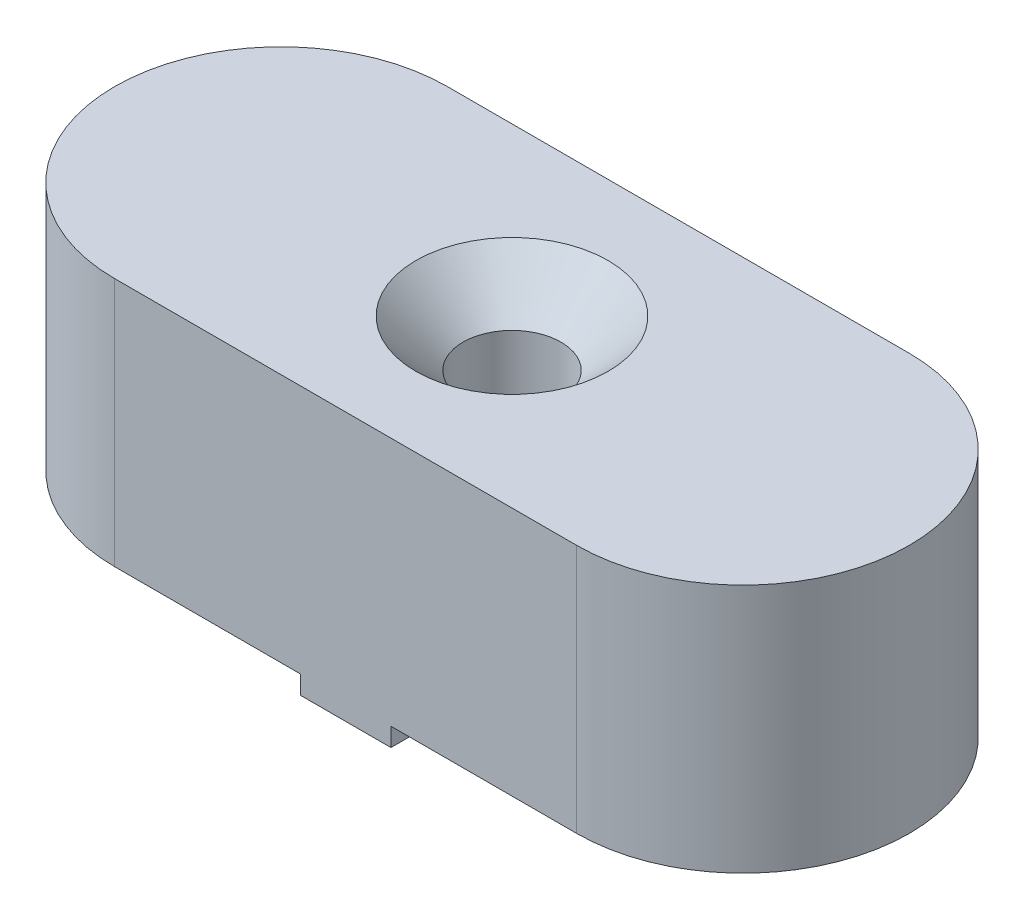
ISO-10303-21;
HEADER;
FILE_DESCRIPTION(('STEP AP214'),'2;1');
FILE_NAME('part.step','',(''),(''),'','','');
FILE_SCHEMA(('AUTOMOTIVE_DESIGN { 1 0 10303 214 1 1 1 1 }'));
ENDSEC;
DATA;
#1=APPLICATION_CONTEXT('core data for automotive mechanical design processes');
#2=APPLICATION_PROTOCOL_DEFINITION('international standard','automotive_design',2000,#1);
#3=PRODUCT_CONTEXT('',#1,'mechanical');
#4=PRODUCT('Part','Part','',(#3));
#5=PRODUCT_RELATED_PRODUCT_CATEGORY('part','',(#4));
#6=PRODUCT_DEFINITION_FORMATION('','',#4);
#7=PRODUCT_DEFINITION_CONTEXT('part definition',#1,'design');
#8=PRODUCT_DEFINITION('design','',#6,#7);
#9=PRODUCT_DEFINITION_SHAPE('','',#8);
#10=(LENGTH_UNIT() NAMED_UNIT(*) SI_UNIT(.MILLI.,.METRE.));
#11=(NAMED_UNIT(*) PLANE_ANGLE_UNIT() SI_UNIT($,.RADIAN.));
#12=(NAMED_UNIT(*) SI_UNIT($,.STERADIAN.) SOLID_ANGLE_UNIT());
#13=UNCERTAINTY_MEASURE_WITH_UNIT(LENGTH_MEASURE(1.E-05),#10,'distance_accuracy_value','');
#14=(GEOMETRIC_REPRESENTATION_CONTEXT(3) GLOBAL_UNCERTAINTY_ASSIGNED_CONTEXT((#13)) GLOBAL_UNIT_ASSIGNED_CONTEXT((#10,
#11,#12)) REPRESENTATION_CONTEXT('',''));
#15=CARTESIAN_POINT('',(0.,0.,0.));
#16=DIRECTION('',(0.,0.,1.));
#17=DIRECTION('',(1.,0.,0.));
#18=AXIS2_PLACEMENT_3D('',#15,#16,#17);
#19=CARTESIAN_POINT('',(2.45,-14.5,0.));
#20=DIRECTION('',(-1.,0.,0.));
#21=DIRECTION('',(0.,0.,1.));
#22=AXIS2_PLACEMENT_3D('',#19,#20,#21);
#23=PLANE('',#22);
#24=DIRECTION('',(0.,0.,1.));
#25=VECTOR('',#24,1.);
#26=CARTESIAN_POINT('',(2.45,-14.5,0.));
#27=LINE('',#26,#25);
#28=CARTESIAN_POINT('',(2.45000000000001,-14.5,1.00995049383618));
#29=VERTEX_POINT('',#28);
#30=CARTESIAN_POINT('',(2.45,-14.5,9.));
#31=VERTEX_POINT('',#30);
#32=EDGE_CURVE('E144',#29,#31,#27,.T.);
#33=ORIENTED_EDGE('',*,*,#32,.F.);
#34=DIRECTION('',(0.,1.,0.));
#35=VECTOR('',#34,1.);
#36=CARTESIAN_POINT('',(2.45,0.,1.00995049383618));
#37=LINE('',#36,#35);
#38=CARTESIAN_POINT('',(2.45,-13.5,1.00995049383618));
#39=VERTEX_POINT('',#38);
#40=EDGE_CURVE('E130',#29,#39,#37,.T.);
#41=ORIENTED_EDGE('',*,*,#40,.T.);
#42=DIRECTION('',(0.,0.,1.));
#43=VECTOR('',#42,1.);
#44=CARTESIAN_POINT('',(2.45,-13.5,0.));
#45=LINE('',#44,#43);
#46=CARTESIAN_POINT('',(2.45,-13.5,9.));
#47=VERTEX_POINT('',#46);
#48=EDGE_CURVE('E154',#39,#47,#45,.T.);
#49=ORIENTED_EDGE('',*,*,#48,.T.);
#50=DIRECTION('',(0.,1.,0.));
#51=VECTOR('',#50,1.);
#52=CARTESIAN_POINT('',(2.45,-14.5,9.));
#53=LINE('',#52,#51);
#54=EDGE_CURVE('E148',#31,#47,#53,.T.);
#55=ORIENTED_EDGE('',*,*,#54,.F.);
#56=EDGE_LOOP('',(#33,#41,#49,#55));
#57=FACE_BOUND('',#56,.T.);
#58=ADVANCED_FACE('F43',(#57),#23,.F.);
#59=CARTESIAN_POINT('',(-2.45,-14.5,0.));
#60=DIRECTION('',(1.,0.,0.));
#61=DIRECTION('',(0.,0.,1.));
#62=AXIS2_PLACEMENT_3D('',#59,#60,#61);
#63=PLANE('',#62);
#64=DIRECTION('',(0.,0.,1.));
#65=VECTOR('',#64,1.);
#66=CARTESIAN_POINT('',(-2.45,-14.5,0.));
#67=LINE('',#66,#65);
#68=CARTESIAN_POINT('',(-2.45,-14.5,-9.));
#69=VERTEX_POINT('',#68);
#70=CARTESIAN_POINT('',(-2.45,-14.5,-1.00995049383618));
#71=VERTEX_POINT('',#70);
#72=EDGE_CURVE('E194',#69,#71,#67,.T.);
#73=ORIENTED_EDGE('',*,*,#72,.T.);
#74=DIRECTION('',(0.,1.,0.));
#75=VECTOR('',#74,1.);
#76=CARTESIAN_POINT('',(-2.45,0.,-1.00995049383618));
#77=LINE('',#76,#75);
#78=CARTESIAN_POINT('',(-2.45,-13.5,-1.00995049383618));
#79=VERTEX_POINT('',#78);
#80=EDGE_CURVE('E58',#71,#79,#77,.T.);
#81=ORIENTED_EDGE('',*,*,#80,.T.);
#82=DIRECTION('',(0.,0.,1.));
#83=VECTOR('',#82,1.);
#84=CARTESIAN_POINT('',(-2.45,-13.5,0.));
#85=LINE('',#84,#83);
#86=CARTESIAN_POINT('',(-2.45,-13.5,-9.));
#87=VERTEX_POINT('',#86);
#88=EDGE_CURVE('E234',#87,#79,#85,.T.);
#89=ORIENTED_EDGE('',*,*,#88,.F.);
#90=DIRECTION('',(0.,1.,0.));
#91=VECTOR('',#90,1.);
#92=CARTESIAN_POINT('',(-2.45,-14.5,-9.));
#93=LINE('',#92,#91);
#94=EDGE_CURVE('E232',#69,#87,#93,.T.);
#95=ORIENTED_EDGE('',*,*,#94,.F.);
#96=EDGE_LOOP('',(#73,#81,#89,#95));
#97=FACE_BOUND('',#96,.T.);
#98=ADVANCED_FACE('F282',(#97),#63,.F.);
#99=CARTESIAN_POINT('',(0.,-14.5,0.));
#100=DIRECTION('',(0.,-1.,0.));
#101=DIRECTION('',(0.,0.,-1.));
#102=AXIS2_PLACEMENT_3D('',#99,#100,#101);
#103=PLANE('',#102);
#104=CARTESIAN_POINT('',(0.,-14.5,0.));
#105=DIRECTION('',(0.,-1.,0.));
#106=DIRECTION('',(0.,0.,-1.));
#107=AXIS2_PLACEMENT_3D('',#104,#105,#106);
#108=CIRCLE('',#107,2.64999999999999);
#109=CARTESIAN_POINT('',(-2.45000000000001,-14.5,1.00995049383618));
#110=VERTEX_POINT('',#109);
#111=EDGE_CURVE('E11',#29,#110,#108,.T.);
#112=ORIENTED_EDGE('',*,*,#111,.F.);
#113=ORIENTED_EDGE('',*,*,#32,.T.);
#114=DIRECTION('',(1.,0.,0.));
#115=VECTOR('',#114,1.);
#116=CARTESIAN_POINT('',(0.,-14.5,9.));
#117=LINE('',#116,#115);
#118=CARTESIAN_POINT('',(-2.45,-14.5,9.));
#119=VERTEX_POINT('',#118);
#120=EDGE_CURVE('E213',#119,#31,#117,.T.);
#121=ORIENTED_EDGE('',*,*,#120,.F.);
#122=EDGE_CURVE('E146',#110,#119,#67,.T.);
#123=ORIENTED_EDGE('',*,*,#122,.F.);
#124=EDGE_LOOP('',(#112,#113,#121,#123));
#125=FACE_BOUND('',#124,.T.);
#126=ADVANCED_FACE('F142',(#125),#103,.T.);
#127=CARTESIAN_POINT('',(0.,-13.5,0.));
#128=DIRECTION('',(0.,1.,0.));
#129=DIRECTION('',(0.,0.,1.));
#130=AXIS2_PLACEMENT_3D('',#127,#128,#129);
#131=PLANE('',#130);
#132=ORIENTED_EDGE('',*,*,#48,.F.);
#133=CARTESIAN_POINT('',(0.,-13.5,0.));
#134=DIRECTION('',(0.,1.,0.));
#135=DIRECTION('',(0.,0.,1.));
#136=AXIS2_PLACEMENT_3D('',#133,#134,#135);
#137=CIRCLE('',#136,2.64999999999999);
#138=CARTESIAN_POINT('',(2.45,-13.5,-1.00995049383618));
#139=VERTEX_POINT('',#138);
#140=EDGE_CURVE('E134',#39,#139,#137,.T.);
#141=ORIENTED_EDGE('',*,*,#140,.T.);
#142=CARTESIAN_POINT('',(2.45,-13.5,-9.));
#143=VERTEX_POINT('',#142);
#144=EDGE_CURVE('E66',#143,#139,#45,.T.);
#145=ORIENTED_EDGE('',*,*,#144,.F.);
#146=DIRECTION('',(1.,0.,0.));
#147=VECTOR('',#146,1.);
#148=CARTESIAN_POINT('',(0.,-13.5,-9.));
#149=LINE('',#148,#147);
#150=CARTESIAN_POINT('',(12.5,-13.5,-9.));
#151=VERTEX_POINT('',#150);
#152=EDGE_CURVE('E174',#143,#151,#149,.T.);
#153=ORIENTED_EDGE('',*,*,#152,.T.);
#154=CARTESIAN_POINT('',(12.5,-13.5,0.));
#155=DIRECTION('',(0.,1.,0.));
#156=DIRECTION('',(0.,0.,1.));
#157=AXIS2_PLACEMENT_3D('',#154,#155,#156);
#158=CIRCLE('',#157,9.);
#159=CARTESIAN_POINT('',(12.5,-13.5,9.));
#160=VERTEX_POINT('',#159);
#161=EDGE_CURVE('E171',#151,#160,#158,.F.);
#162=ORIENTED_EDGE('',*,*,#161,.T.);
#163=DIRECTION('',(1.,0.,0.));
#164=VECTOR('',#163,1.);
#165=CARTESIAN_POINT('',(0.,-13.5,9.));
#166=LINE('',#165,#164);
#167=EDGE_CURVE('E203',#47,#160,#166,.T.);
#168=ORIENTED_EDGE('',*,*,#167,.F.);
#169=EDGE_LOOP('',(#132,#141,#145,#153,#162,#168));
#170=FACE_BOUND('',#169,.T.);
#171=CARTESIAN_POINT('',(12.5,-13.5,0.));
#172=DIRECTION('',(0.,1.,0.));
#173=DIRECTION('',(0.,0.,1.));
#174=AXIS2_PLACEMENT_3D('',#171,#172,#173);
#175=CIRCLE('',#174,6.25);
#176=CARTESIAN_POINT('',(12.5,-13.5,6.25));
#177=VERTEX_POINT('',#176);
#178=EDGE_CURVE('E168',#177,#177,#175,.T.);
#179=ORIENTED_EDGE('',*,*,#178,.T.);
#180=EDGE_LOOP('',(#179));
#181=FACE_BOUND('',#180,.T.);
#182=ADVANCED_FACE('F198',(#170,#181),#131,.F.);
#183=CARTESIAN_POINT('',(12.5,-13.5,0.));
#184=DIRECTION('',(0.,1.,0.));
#185=DIRECTION('',(0.,0.,1.));
#186=AXIS2_PLACEMENT_3D('',#183,#184,#185);
#187=CYLINDRICAL_SURFACE('',#186,6.25);
#188=CARTESIAN_POINT('',(12.5,-0.6,0.));
#189=DIRECTION('',(0.,1.,0.));
#190=DIRECTION('',(0.,0.,1.));
#191=AXIS2_PLACEMENT_3D('',#188,#189,#190);
#192=CIRCLE('',#191,6.25);
#193=CARTESIAN_POINT('',(12.5,-0.6,6.25));
#194=VERTEX_POINT('',#193);
#195=EDGE_CURVE('E164',#194,#194,#192,.T.);
#196=ORIENTED_EDGE('',*,*,#195,.T.);
#197=EDGE_LOOP('',(#196));
#198=FACE_BOUND('',#197,.T.);
#199=ORIENTED_EDGE('',*,*,#178,.F.);
#200=EDGE_LOOP('',(#199));
#201=FACE_BOUND('',#200,.T.);
#202=ADVANCED_FACE('F45',(#198,#201),#187,.F.);
#203=CARTESIAN_POINT('',(0.,-13.5,-9.));
#204=DIRECTION('',(0.,0.,1.));
#205=DIRECTION('',(1.,0.,0.));
#206=AXIS2_PLACEMENT_3D('',#203,#204,#205);
#207=PLANE('',#206);
#208=DIRECTION('',(1.,0.,0.));
#209=VECTOR('',#208,1.);
#210=CARTESIAN_POINT('',(0.,0.,-9.));
#211=LINE('',#210,#209);
#212=CARTESIAN_POINT('',(-12.5,0.,-9.));
#213=VERTEX_POINT('',#212);
#214=CARTESIAN_POINT('',(12.5,0.,-9.));
#215=VERTEX_POINT('',#214);
#216=EDGE_CURVE('E172',#213,#215,#211,.T.);
#217=ORIENTED_EDGE('',*,*,#216,.T.);
#218=DIRECTION('',(0.,1.,0.));
#219=VECTOR('',#218,1.);
#220=CARTESIAN_POINT('',(12.5,-13.5,-9.));
#221=LINE('',#220,#219);
#222=EDGE_CURVE('E176',#151,#215,#221,.T.);
#223=ORIENTED_EDGE('',*,*,#222,.F.);
#224=ORIENTED_EDGE('',*,*,#152,.F.);
#225=DIRECTION('',(0.,1.,0.));
#226=VECTOR('',#225,1.);
#227=CARTESIAN_POINT('',(2.45,-14.5,-9.));
#228=LINE('',#227,#226);
#229=CARTESIAN_POINT('',(2.45,-14.5,-9.));
#230=VERTEX_POINT('',#229);
#231=EDGE_CURVE('E160',#230,#143,#228,.T.);
#232=ORIENTED_EDGE('',*,*,#231,.F.);
#233=DIRECTION('',(1.,0.,0.));
#234=VECTOR('',#233,1.);
#235=CARTESIAN_POINT('',(0.,-14.5,-9.));
#236=LINE('',#235,#234);
#237=EDGE_CURVE('E153',#69,#230,#236,.T.);
#238=ORIENTED_EDGE('',*,*,#237,.F.);
#239=ORIENTED_EDGE('',*,*,#94,.T.);
#240=DIRECTION('',(-1.,0.,0.));
#241=VECTOR('',#240,1.);
#242=CARTESIAN_POINT('',(0.,-13.5,-9.));
#243=LINE('',#242,#241);
#244=CARTESIAN_POINT('',(-12.5,-13.5,-9.));
#245=VERTEX_POINT('',#244);
#246=EDGE_CURVE('E218',#87,#245,#243,.T.);
#247=ORIENTED_EDGE('',*,*,#246,.T.);
#248=DIRECTION('',(0.,1.,0.));
#249=VECTOR('',#248,1.);
#250=CARTESIAN_POINT('',(-12.5,-13.5,-9.));
#251=LINE('',#250,#249);
#252=EDGE_CURVE('E215',#245,#213,#251,.T.);
#253=ORIENTED_EDGE('',*,*,#252,.T.);
#254=EDGE_LOOP('',(#217,#223,#224,#232,#238,#239,#247,#253));
#255=FACE_BOUND('',#254,.T.);
#256=ADVANCED_FACE('F197',(#255),#207,.F.);
#257=CARTESIAN_POINT('',(12.5,-13.5,0.));
#258=DIRECTION('',(0.,1.,0.));
#259=DIRECTION('',(0.,0.,1.));
#260=AXIS2_PLACEMENT_3D('',#257,#258,#259);
#261=CYLINDRICAL_SURFACE('',#260,9.);
#262=CARTESIAN_POINT('',(12.5,0.,0.));
#263=DIRECTION('',(0.,1.,0.));
#264=DIRECTION('',(0.,0.,1.));
#265=AXIS2_PLACEMENT_3D('',#262,#263,#264);
#266=CIRCLE('',#265,9.);
#267=CARTESIAN_POINT('',(12.5,0.,9.));
#268=VERTEX_POINT('',#267);
#269=EDGE_CURVE('E167',#215,#268,#266,.F.);
#270=ORIENTED_EDGE('',*,*,#269,.T.);
#271=DIRECTION('',(0.,1.,0.));
#272=VECTOR('',#271,1.);
#273=CARTESIAN_POINT('',(12.5,-13.5,9.));
#274=LINE('',#273,#272);
#275=EDGE_CURVE('E158',#160,#268,#274,.T.);
#276=ORIENTED_EDGE('',*,*,#275,.F.);
#277=ORIENTED_EDGE('',*,*,#161,.F.);
#278=ORIENTED_EDGE('',*,*,#222,.T.);
#279=EDGE_LOOP('',(#270,#276,#277,#278));
#280=FACE_BOUND('',#279,.T.);
#281=ADVANCED_FACE('F205',(#280),#261,.T.);
#282=CARTESIAN_POINT('',(0.,0.,0.));
#283=DIRECTION('',(0.,1.,0.));
#284=DIRECTION('',(0.,0.,1.));
#285=AXIS2_PLACEMENT_3D('',#282,#283,#284);
#286=PLANE('',#285);
#287=CARTESIAN_POINT('',(0.,0.,0.));
#288=DIRECTION('',(0.,1.,0.));
#289=DIRECTION('',(0.,0.,1.));
#290=AXIS2_PLACEMENT_3D('',#287,#288,#289);
#291=CIRCLE('',#290,5.2);
#292=CARTESIAN_POINT('',(0.,0.,5.2));
#293=VERTEX_POINT('',#292);
#294=EDGE_CURVE('E257',#293,#293,#291,.T.);
#295=ORIENTED_EDGE('',*,*,#294,.F.);
#296=EDGE_LOOP('',(#295));
#297=FACE_BOUND('',#296,.T.);
#298=DIRECTION('',(1.,0.,0.));
#299=VECTOR('',#298,1.);
#300=CARTESIAN_POINT('',(0.,0.,9.));
#301=LINE('',#300,#299);
#302=CARTESIAN_POINT('',(-12.5,0.,9.));
#303=VERTEX_POINT('',#302);
#304=EDGE_CURVE('E209',#303,#268,#301,.T.);
#305=ORIENTED_EDGE('',*,*,#304,.T.);
#306=ORIENTED_EDGE('',*,*,#269,.F.);
#307=ORIENTED_EDGE('',*,*,#216,.F.);
#308=CARTESIAN_POINT('',(-12.5,0.,0.));
#309=DIRECTION('',(0.,-1.,0.));
#310=DIRECTION('',(0.,0.,1.));
#311=AXIS2_PLACEMENT_3D('',#308,#309,#310);
#312=CIRCLE('',#311,9.);
#313=EDGE_CURVE('E219',#213,#303,#312,.F.);
#314=ORIENTED_EDGE('',*,*,#313,.T.);
#315=EDGE_LOOP('',(#305,#306,#307,#314));
#316=FACE_BOUND('',#315,.T.);
#317=ADVANCED_FACE('F263',(#297,#316),#286,.T.);
#318=CARTESIAN_POINT('',(0.,-0.6,0.));
#319=DIRECTION('',(0.,1.,0.));
#320=DIRECTION('',(0.,0.,1.));
#321=AXIS2_PLACEMENT_3D('',#318,#319,#320);
#322=PLANE('',#321);
#323=ORIENTED_EDGE('',*,*,#195,.F.);
#324=EDGE_LOOP('',(#323));
#325=FACE_BOUND('',#324,.T.);
#326=ADVANCED_FACE('F266',(#325),#322,.F.);
#327=ORIENTED_EDGE('',*,*,#144,.T.);
#328=DIRECTION('',(0.,1.,0.));
#329=VECTOR('',#328,1.);
#330=CARTESIAN_POINT('',(2.45,0.,-1.00995049383618));
#331=LINE('',#330,#329);
#332=CARTESIAN_POINT('',(2.45000000000001,-14.5,-1.00995049383618));
#333=VERTEX_POINT('',#332);
#334=EDGE_CURVE('E184',#139,#333,#331,.F.);
#335=ORIENTED_EDGE('',*,*,#334,.T.);
#336=EDGE_CURVE('E150',#230,#333,#27,.T.);
#337=ORIENTED_EDGE('',*,*,#336,.F.);
#338=ORIENTED_EDGE('',*,*,#231,.T.);
#339=EDGE_LOOP('',(#327,#335,#337,#338));
#340=FACE_BOUND('',#339,.T.);
#341=ADVANCED_FACE('F190',(#340),#23,.F.);
#342=EDGE_CURVE('E47',#71,#333,#108,.T.);
#343=ORIENTED_EDGE('',*,*,#342,.F.);
#344=ORIENTED_EDGE('',*,*,#72,.F.);
#345=ORIENTED_EDGE('',*,*,#237,.T.);
#346=ORIENTED_EDGE('',*,*,#336,.T.);
#347=EDGE_LOOP('',(#343,#344,#345,#346));
#348=FACE_BOUND('',#347,.T.);
#349=ADVANCED_FACE('F192',(#348),#103,.T.);
#350=CARTESIAN_POINT('',(0.,-13.5,9.));
#351=DIRECTION('',(0.,0.,-1.));
#352=DIRECTION('',(1.,0.,0.));
#353=AXIS2_PLACEMENT_3D('',#350,#351,#352);
#354=PLANE('',#353);
#355=ORIENTED_EDGE('',*,*,#304,.F.);
#356=DIRECTION('',(0.,1.,0.));
#357=VECTOR('',#356,1.);
#358=CARTESIAN_POINT('',(-12.5,-13.5,9.));
#359=LINE('',#358,#357);
#360=CARTESIAN_POINT('',(-12.5,-13.5,9.));
#361=VERTEX_POINT('',#360);
#362=EDGE_CURVE('E239',#361,#303,#359,.T.);
#363=ORIENTED_EDGE('',*,*,#362,.F.);
#364=DIRECTION('',(-1.,0.,0.));
#365=VECTOR('',#364,1.);
#366=CARTESIAN_POINT('',(0.,-13.5,9.));
#367=LINE('',#366,#365);
#368=CARTESIAN_POINT('',(-2.45,-13.5,9.));
#369=VERTEX_POINT('',#368);
#370=EDGE_CURVE('E242',#369,#361,#367,.T.);
#371=ORIENTED_EDGE('',*,*,#370,.F.);
#372=DIRECTION('',(0.,1.,0.));
#373=VECTOR('',#372,1.);
#374=CARTESIAN_POINT('',(-2.45,-14.5,9.));
#375=LINE('',#374,#373);
#376=EDGE_CURVE('E138',#119,#369,#375,.T.);
#377=ORIENTED_EDGE('',*,*,#376,.F.);
#378=ORIENTED_EDGE('',*,*,#120,.T.);
#379=ORIENTED_EDGE('',*,*,#54,.T.);
#380=ORIENTED_EDGE('',*,*,#167,.T.);
#381=ORIENTED_EDGE('',*,*,#275,.T.);
#382=EDGE_LOOP('',(#355,#363,#371,#377,#378,#379,#380,#381));
#383=FACE_BOUND('',#382,.T.);
#384=ADVANCED_FACE('F208',(#383),#354,.F.);
#385=CARTESIAN_POINT('',(0.,-13.5,0.));
#386=DIRECTION('',(0.,1.,0.));
#387=DIRECTION('',(0.,0.,1.));
#388=AXIS2_PLACEMENT_3D('',#385,#386,#387);
#389=PLANE('',#388);
#390=CARTESIAN_POINT('',(-12.5,-13.5,0.));
#391=DIRECTION('',(0.,-1.,0.));
#392=DIRECTION('',(0.,0.,1.));
#393=AXIS2_PLACEMENT_3D('',#390,#391,#392);
#394=CIRCLE('',#393,6.25);
#395=CARTESIAN_POINT('',(-12.5,-13.5,6.25));
#396=VERTEX_POINT('',#395);
#397=EDGE_CURVE('E222',#396,#396,#394,.T.);
#398=ORIENTED_EDGE('',*,*,#397,.F.);
#399=EDGE_LOOP('',(#398));
#400=FACE_BOUND('',#399,.T.);
#401=ORIENTED_EDGE('',*,*,#88,.T.);
#402=CARTESIAN_POINT('',(0.,-13.5,0.));
#403=DIRECTION('',(0.,1.,0.));
#404=DIRECTION('',(0.,0.,1.));
#405=AXIS2_PLACEMENT_3D('',#402,#403,#404);
#406=CIRCLE('',#405,2.64999999999999);
#407=CARTESIAN_POINT('',(-2.45,-13.5,1.00995049383618));
#408=VERTEX_POINT('',#407);
#409=EDGE_CURVE('E251',#79,#408,#406,.T.);
#410=ORIENTED_EDGE('',*,*,#409,.T.);
#411=EDGE_CURVE('E237',#408,#369,#85,.T.);
#412=ORIENTED_EDGE('',*,*,#411,.T.);
#413=ORIENTED_EDGE('',*,*,#370,.T.);
#414=CARTESIAN_POINT('',(-12.5,-13.5,0.));
#415=DIRECTION('',(0.,-1.,0.));
#416=DIRECTION('',(0.,0.,1.));
#417=AXIS2_PLACEMENT_3D('',#414,#415,#416);
#418=CIRCLE('',#417,9.);
#419=EDGE_CURVE('E226',#245,#361,#418,.F.);
#420=ORIENTED_EDGE('',*,*,#419,.F.);
#421=ORIENTED_EDGE('',*,*,#246,.F.);
#422=EDGE_LOOP('',(#401,#410,#412,#413,#420,#421));
#423=FACE_BOUND('',#422,.T.);
#424=ADVANCED_FACE('F275',(#400,#423),#389,.F.);
#425=CARTESIAN_POINT('',(-12.5,-13.5,0.));
#426=DIRECTION('',(0.,1.,0.));
#427=DIRECTION('',(0.,0.,1.));
#428=AXIS2_PLACEMENT_3D('',#425,#426,#427);
#429=CYLINDRICAL_SURFACE('',#428,6.25);
#430=CARTESIAN_POINT('',(-12.5,-0.6,0.));
#431=DIRECTION('',(0.,-1.,0.));
#432=DIRECTION('',(0.,0.,1.));
#433=AXIS2_PLACEMENT_3D('',#430,#431,#432);
#434=CIRCLE('',#433,6.25);
#435=CARTESIAN_POINT('',(-12.5,-0.6,6.25));
#436=VERTEX_POINT('',#435);
#437=EDGE_CURVE('E223',#436,#436,#434,.T.);
#438=ORIENTED_EDGE('',*,*,#437,.F.);
#439=EDGE_LOOP('',(#438));
#440=FACE_BOUND('',#439,.T.);
#441=ORIENTED_EDGE('',*,*,#397,.T.);
#442=EDGE_LOOP('',(#441));
#443=FACE_BOUND('',#442,.T.);
#444=ADVANCED_FACE('F286',(#440,#443),#429,.F.);
#445=CARTESIAN_POINT('',(-12.5,-13.5,0.));
#446=DIRECTION('',(0.,1.,0.));
#447=DIRECTION('',(0.,0.,1.));
#448=AXIS2_PLACEMENT_3D('',#445,#446,#447);
#449=CYLINDRICAL_SURFACE('',#448,9.);
#450=ORIENTED_EDGE('',*,*,#313,.F.);
#451=ORIENTED_EDGE('',*,*,#252,.F.);
#452=ORIENTED_EDGE('',*,*,#419,.T.);
#453=ORIENTED_EDGE('',*,*,#362,.T.);
#454=EDGE_LOOP('',(#450,#451,#452,#453));
#455=FACE_BOUND('',#454,.T.);
#456=ADVANCED_FACE('F283',(#455),#449,.T.);
#457=CARTESIAN_POINT('',(0.,-0.6,0.));
#458=DIRECTION('',(0.,1.,0.));
#459=DIRECTION('',(0.,0.,1.));
#460=AXIS2_PLACEMENT_3D('',#457,#458,#459);
#461=PLANE('',#460);
#462=ORIENTED_EDGE('',*,*,#437,.T.);
#463=EDGE_LOOP('',(#462));
#464=FACE_BOUND('',#463,.T.);
#465=ADVANCED_FACE('F285',(#464),#461,.F.);
#466=ORIENTED_EDGE('',*,*,#411,.F.);
#467=DIRECTION('',(0.,1.,0.));
#468=VECTOR('',#467,1.);
#469=CARTESIAN_POINT('',(-2.45,0.,1.00995049383618));
#470=LINE('',#469,#468);
#471=EDGE_CURVE('E249',#408,#110,#470,.F.);
#472=ORIENTED_EDGE('',*,*,#471,.T.);
#473=ORIENTED_EDGE('',*,*,#122,.T.);
#474=ORIENTED_EDGE('',*,*,#376,.T.);
#475=EDGE_LOOP('',(#466,#472,#473,#474));
#476=FACE_BOUND('',#475,.T.);
#477=ADVANCED_FACE('F279',(#476),#63,.F.);
#478=CARTESIAN_POINT('',(0.,0.,0.));
#479=DIRECTION('',(0.,1.,0.));
#480=DIRECTION('',(0.,0.,1.));
#481=AXIS2_PLACEMENT_3D('',#478,#479,#480);
#482=CYLINDRICAL_SURFACE('',#481,2.64999999999999);
#483=CARTESIAN_POINT('',(0.,-2.55000000000001,0.));
#484=DIRECTION('',(0.,1.,0.));
#485=DIRECTION('',(0.,0.,1.));
#486=AXIS2_PLACEMENT_3D('',#483,#484,#485);
#487=CIRCLE('',#486,2.64999999999999);
#488=CARTESIAN_POINT('',(0.,-2.55000000000001,2.64999999999999));
#489=VERTEX_POINT('',#488);
#490=EDGE_CURVE('E254',#489,#489,#487,.T.);
#491=ORIENTED_EDGE('',*,*,#490,.T.);
#492=EDGE_LOOP('',(#491));
#493=FACE_BOUND('',#492,.T.);
#494=ORIENTED_EDGE('',*,*,#111,.T.);
#495=ORIENTED_EDGE('',*,*,#471,.F.);
#496=ORIENTED_EDGE('',*,*,#409,.F.);
#497=ORIENTED_EDGE('',*,*,#80,.F.);
#498=ORIENTED_EDGE('',*,*,#342,.T.);
#499=ORIENTED_EDGE('',*,*,#334,.F.);
#500=ORIENTED_EDGE('',*,*,#140,.F.);
#501=ORIENTED_EDGE('',*,*,#40,.F.);
#502=EDGE_LOOP('',(#494,#495,#496,#497,#498,#499,#500,#501));
#503=FACE_BOUND('',#502,.T.);
#504=ADVANCED_FACE('F132',(#493,#503),#482,.F.);
#505=CARTESIAN_POINT('',(0.,0.,0.));
#506=DIRECTION('',(0.,1.,0.));
#507=DIRECTION('',(0.,0.,1.));
#508=AXIS2_PLACEMENT_3D('',#505,#506,#507);
#509=CONICAL_SURFACE('',#508,5.2,0.785398163397448);
#510=ORIENTED_EDGE('',*,*,#490,.F.);
#511=EDGE_LOOP('',(#510));
#512=FACE_BOUND('',#511,.T.);
#513=ORIENTED_EDGE('',*,*,#294,.T.);
#514=EDGE_LOOP('',(#513));
#515=FACE_BOUND('',#514,.T.);
#516=ADVANCED_FACE('F261',(#512,#515),#509,.F.);
#517=CLOSED_SHELL('',(#58,#98,#126,#182,#202,#256,#281,#317,#326,#341,#349,#384,#424,#444,#456,
#465,#477,#504,#516));
#518=MANIFOLD_SOLID_BREP('B2',#517);
#519=ADVANCED_BREP_SHAPE_REPRESENTATION('',(#18,#518),#14);
#520=SHAPE_DEFINITION_REPRESENTATION(#9,#519);
ENDSEC;
END-ISO-10303-21;
